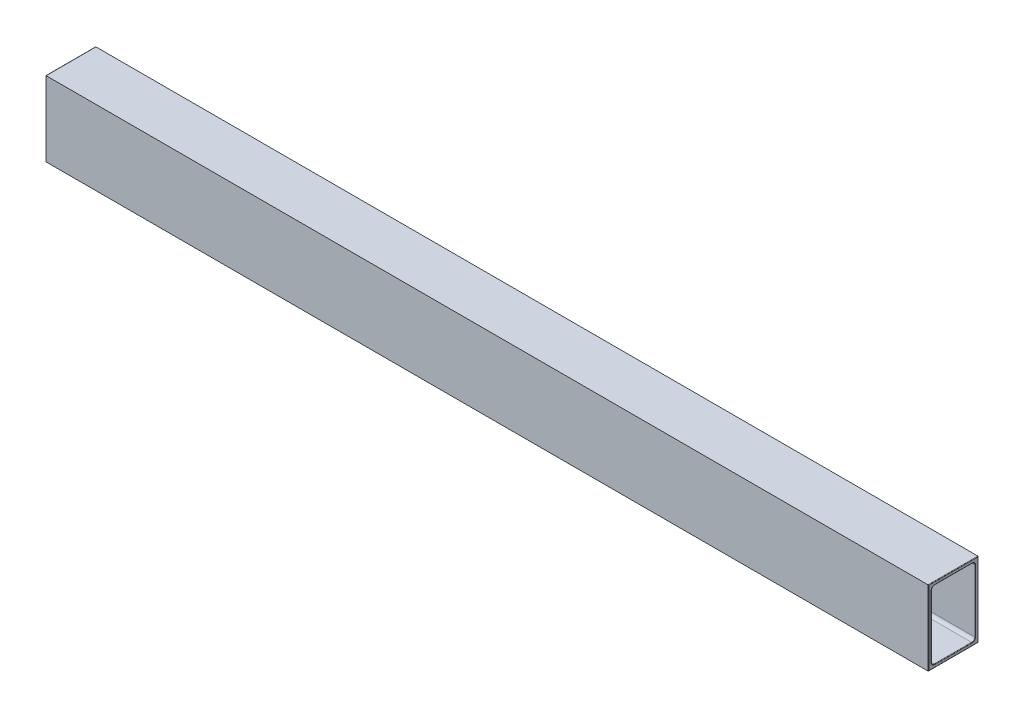
ISO-10303-21;
HEADER;
FILE_DESCRIPTION(('STEP AP214'),'2;1');
FILE_NAME('part.step','',(''),(''),'','','');
FILE_SCHEMA(('AUTOMOTIVE_DESIGN { 1 0 10303 214 1 1 1 1 }'));
ENDSEC;
DATA;
#1=APPLICATION_CONTEXT('core data for automotive mechanical design processes');
#2=APPLICATION_PROTOCOL_DEFINITION('international standard','automotive_design',2000,#1);
#3=PRODUCT_CONTEXT('',#1,'mechanical');
#4=PRODUCT('Part','Part','',(#3));
#5=PRODUCT_RELATED_PRODUCT_CATEGORY('part','',(#4));
#6=PRODUCT_DEFINITION_FORMATION('','',#4);
#7=PRODUCT_DEFINITION_CONTEXT('part definition',#1,'design');
#8=PRODUCT_DEFINITION('design','',#6,#7);
#9=PRODUCT_DEFINITION_SHAPE('','',#8);
#10=(LENGTH_UNIT() NAMED_UNIT(*) SI_UNIT(.MILLI.,.METRE.));
#11=(NAMED_UNIT(*) PLANE_ANGLE_UNIT() SI_UNIT($,.RADIAN.));
#12=(NAMED_UNIT(*) SI_UNIT($,.STERADIAN.) SOLID_ANGLE_UNIT());
#13=UNCERTAINTY_MEASURE_WITH_UNIT(LENGTH_MEASURE(1.E-05),#10,'distance_accuracy_value','');
#14=(GEOMETRIC_REPRESENTATION_CONTEXT(3) GLOBAL_UNCERTAINTY_ASSIGNED_CONTEXT((#13)) GLOBAL_UNIT_ASSIGNED_CONTEXT((#10,
#11,#12)) REPRESENTATION_CONTEXT('',''));
#15=CARTESIAN_POINT('',(0.,0.,0.));
#16=DIRECTION('',(0.,0.,1.));
#17=DIRECTION('',(1.,0.,0.));
#18=AXIS2_PLACEMENT_3D('',#15,#16,#17);
#19=CARTESIAN_POINT('',(1800.,0.,0.));
#20=DIRECTION('',(0.,1.,0.));
#21=DIRECTION('',(0.,0.,1.));
#22=AXIS2_PLACEMENT_3D('',#19,#20,#21);
#23=PLANE('',#22);
#24=DIRECTION('',(0.,0.,-1.));
#25=VECTOR('',#24,1.);
#26=CARTESIAN_POINT('',(747.6,0.,0.));
#27=LINE('',#26,#25);
#28=CARTESIAN_POINT('',(747.6,0.,101.6));
#29=VERTEX_POINT('',#28);
#30=CARTESIAN_POINT('',(747.6,0.,0.));
#31=VERTEX_POINT('',#30);
#32=EDGE_CURVE('E11',#29,#31,#27,.T.);
#33=ORIENTED_EDGE('',*,*,#32,.F.);
#34=DIRECTION('',(-1.,0.,0.));
#35=VECTOR('',#34,1.);
#36=CARTESIAN_POINT('',(1800.,0.,101.6));
#37=LINE('',#36,#35);
#38=CARTESIAN_POINT('',(0.99999999999989,0.,101.6));
#39=VERTEX_POINT('',#38);
#40=EDGE_CURVE('E448',#29,#39,#37,.T.);
#41=ORIENTED_EDGE('',*,*,#40,.T.);
#42=DIRECTION('',(0.,0.,-1.));
#43=VECTOR('',#42,1.);
#44=CARTESIAN_POINT('',(0.99999999999989,0.,0.));
#45=LINE('',#44,#43);
#46=CARTESIAN_POINT('',(0.99999999999989,0.,0.));
#47=VERTEX_POINT('',#46);
#48=EDGE_CURVE('E219',#39,#47,#45,.T.);
#49=ORIENTED_EDGE('',*,*,#48,.T.);
#50=DIRECTION('',(-1.,0.,0.));
#51=VECTOR('',#50,1.);
#52=CARTESIAN_POINT('',(1800.,0.,0.));
#53=LINE('',#52,#51);
#54=EDGE_CURVE('E454',#31,#47,#53,.T.);
#55=ORIENTED_EDGE('',*,*,#54,.F.);
#56=EDGE_LOOP('',(#33,#41,#49,#55));
#57=FACE_BOUND('',#56,.T.);
#58=ADVANCED_FACE('F35',(#57),#23,.F.);
#59=DIRECTION('',(0.,0.,1.));
#60=VECTOR('',#59,1.);
#61=CARTESIAN_POINT('',(1052.4,0.,0.));
#62=LINE('',#61,#60);
#63=CARTESIAN_POINT('',(1052.4,0.,0.));
#64=VERTEX_POINT('',#63);
#65=CARTESIAN_POINT('',(1052.4,0.,101.6));
#66=VERTEX_POINT('',#65);
#67=EDGE_CURVE('E44',#64,#66,#62,.T.);
#68=ORIENTED_EDGE('',*,*,#67,.F.);
#69=CARTESIAN_POINT('',(1799.,0.,0.));
#70=VERTEX_POINT('',#69);
#71=EDGE_CURVE('E450',#70,#64,#53,.T.);
#72=ORIENTED_EDGE('',*,*,#71,.F.);
#73=DIRECTION('',(0.,0.,-1.));
#74=VECTOR('',#73,1.);
#75=CARTESIAN_POINT('',(1799.,0.,101.6));
#76=LINE('',#75,#74);
#77=CARTESIAN_POINT('',(1799.,0.,101.6));
#78=VERTEX_POINT('',#77);
#79=EDGE_CURVE('E303',#70,#78,#76,.F.);
#80=ORIENTED_EDGE('',*,*,#79,.T.);
#81=EDGE_CURVE('E443',#78,#66,#37,.T.);
#82=ORIENTED_EDGE('',*,*,#81,.T.);
#83=EDGE_LOOP('',(#68,#72,#80,#82));
#84=FACE_BOUND('',#83,.T.);
#85=ADVANCED_FACE('F567',(#84),#23,.F.);
#86=CARTESIAN_POINT('',(1800.,0.,0.));
#87=DIRECTION('',(1.,0.,0.));
#88=DIRECTION('',(0.,0.,-1.));
#89=AXIS2_PLACEMENT_3D('',#86,#87,#88);
#90=PLANE('',#89);
#91=DIRECTION('',(0.,1.,0.));
#92=VECTOR('',#91,1.);
#93=CARTESIAN_POINT('',(1800.,0.,5.35));
#94=LINE('',#93,#92);
#95=CARTESIAN_POINT('',(1800.,139.7,5.34999999999999));
#96=VERTEX_POINT('',#95);
#97=CARTESIAN_POINT('',(1800.,12.7,5.35));
#98=VERTEX_POINT('',#97);
#99=EDGE_CURVE('E271',#96,#98,#94,.F.);
#100=ORIENTED_EDGE('',*,*,#99,.T.);
#101=CARTESIAN_POINT('',(1800.,12.7,12.7));
#102=DIRECTION('',(1.,0.,0.));
#103=DIRECTION('',(0.,0.,-1.));
#104=AXIS2_PLACEMENT_3D('',#101,#102,#103);
#105=CIRCLE('',#104,7.35);
#106=CARTESIAN_POINT('',(1800.,5.35,12.7));
#107=VERTEX_POINT('',#106);
#108=EDGE_CURVE('E273',#98,#107,#105,.F.);
#109=ORIENTED_EDGE('',*,*,#108,.T.);
#110=DIRECTION('',(0.,0.,-1.));
#111=VECTOR('',#110,1.);
#112=CARTESIAN_POINT('',(1800.,5.35,0.));
#113=LINE('',#112,#111);
#114=CARTESIAN_POINT('',(1800.,5.34999999999999,88.9));
#115=VERTEX_POINT('',#114);
#116=EDGE_CURVE('E236',#107,#115,#113,.F.);
#117=ORIENTED_EDGE('',*,*,#116,.T.);
#118=CARTESIAN_POINT('',(1800.,12.7,88.9));
#119=DIRECTION('',(1.,0.,0.));
#120=DIRECTION('',(0.,0.,-1.));
#121=AXIS2_PLACEMENT_3D('',#118,#119,#120);
#122=CIRCLE('',#121,7.35);
#123=CARTESIAN_POINT('',(1800.,12.7,96.25));
#124=VERTEX_POINT('',#123);
#125=EDGE_CURVE('E261',#115,#124,#122,.F.);
#126=ORIENTED_EDGE('',*,*,#125,.T.);
#127=DIRECTION('',(0.,-1.,0.));
#128=VECTOR('',#127,1.);
#129=CARTESIAN_POINT('',(1800.,0.,96.25));
#130=LINE('',#129,#128);
#131=CARTESIAN_POINT('',(1800.,139.7,96.25));
#132=VERTEX_POINT('',#131);
#133=EDGE_CURVE('E263',#124,#132,#130,.F.);
#134=ORIENTED_EDGE('',*,*,#133,.T.);
#135=CARTESIAN_POINT('',(1800.,139.7,88.9));
#136=DIRECTION('',(1.,0.,0.));
#137=DIRECTION('',(0.,0.,-1.));
#138=AXIS2_PLACEMENT_3D('',#135,#136,#137);
#139=CIRCLE('',#138,7.34999999999999);
#140=CARTESIAN_POINT('',(1800.,147.05,88.9));
#141=VERTEX_POINT('',#140);
#142=EDGE_CURVE('E265',#132,#141,#139,.F.);
#143=ORIENTED_EDGE('',*,*,#142,.T.);
#144=DIRECTION('',(0.,0.,1.));
#145=VECTOR('',#144,1.);
#146=CARTESIAN_POINT('',(1800.,147.05,1.07124865991555E-13));
#147=LINE('',#146,#145);
#148=CARTESIAN_POINT('',(1800.,147.05,12.7));
#149=VERTEX_POINT('',#148);
#150=EDGE_CURVE('E267',#141,#149,#147,.F.);
#151=ORIENTED_EDGE('',*,*,#150,.T.);
#152=CARTESIAN_POINT('',(1800.,139.7,12.7));
#153=DIRECTION('',(1.,0.,0.));
#154=DIRECTION('',(0.,0.,-1.));
#155=AXIS2_PLACEMENT_3D('',#152,#153,#154);
#156=CIRCLE('',#155,7.35000000000001);
#157=EDGE_CURVE('E269',#149,#96,#156,.F.);
#158=ORIENTED_EDGE('',*,*,#157,.T.);
#159=EDGE_LOOP('',(#100,#109,#117,#126,#134,#143,#151,#158));
#160=FACE_BOUND('',#159,.T.);
#161=DIRECTION('',(0.,-1.,0.));
#162=VECTOR('',#161,1.);
#163=CARTESIAN_POINT('',(1800.,0.,100.6));
#164=LINE('',#163,#162);
#165=CARTESIAN_POINT('',(1800.,151.4,100.6));
#166=VERTEX_POINT('',#165);
#167=CARTESIAN_POINT('',(1800.,0.999999999999982,100.6));
#168=VERTEX_POINT('',#167);
#169=EDGE_CURVE('E255',#166,#168,#164,.T.);
#170=ORIENTED_EDGE('',*,*,#169,.T.);
#171=DIRECTION('',(0.,0.,-1.));
#172=VECTOR('',#171,1.);
#173=CARTESIAN_POINT('',(1800.,1.,0.));
#174=LINE('',#173,#172);
#175=CARTESIAN_POINT('',(1800.,1.,1.));
#176=VERTEX_POINT('',#175);
#177=EDGE_CURVE('E257',#168,#176,#174,.T.);
#178=ORIENTED_EDGE('',*,*,#177,.T.);
#179=DIRECTION('',(0.,1.,0.));
#180=VECTOR('',#179,1.);
#181=CARTESIAN_POINT('',(1800.,152.4,1.));
#182=LINE('',#181,#180);
#183=CARTESIAN_POINT('',(1800.,151.4,1.));
#184=VERTEX_POINT('',#183);
#185=EDGE_CURVE('E246',#176,#184,#182,.T.);
#186=ORIENTED_EDGE('',*,*,#185,.T.);
#187=DIRECTION('',(0.,0.,1.));
#188=VECTOR('',#187,1.);
#189=CARTESIAN_POINT('',(1800.,151.4,101.6));
#190=LINE('',#189,#188);
#191=EDGE_CURVE('E248',#184,#166,#190,.T.);
#192=ORIENTED_EDGE('',*,*,#191,.T.);
#193=EDGE_LOOP('',(#170,#178,#186,#192));
#194=FACE_BOUND('',#193,.T.);
#195=ADVANCED_FACE('F537',(#160,#194),#90,.T.);
#196=CARTESIAN_POINT('',(0.,0.,0.));
#197=DIRECTION('',(1.,0.,0.));
#198=DIRECTION('',(0.,0.,-1.));
#199=AXIS2_PLACEMENT_3D('',#196,#197,#198);
#200=PLANE('',#199);
#201=CARTESIAN_POINT('',(0.,139.7,88.9));
#202=DIRECTION('',(1.,0.,0.));
#203=DIRECTION('',(0.,0.,-1.));
#204=AXIS2_PLACEMENT_3D('',#201,#202,#203);
#205=CIRCLE('',#204,7.34999999999999);
#206=CARTESIAN_POINT('',(0.,147.05,88.9));
#207=VERTEX_POINT('',#206);
#208=CARTESIAN_POINT('',(0.,139.7,96.25));
#209=VERTEX_POINT('',#208);
#210=EDGE_CURVE('E341',#207,#209,#205,.T.);
#211=ORIENTED_EDGE('',*,*,#210,.T.);
#212=DIRECTION('',(0.,-1.,0.));
#213=VECTOR('',#212,1.);
#214=CARTESIAN_POINT('',(0.,12.7,96.25));
#215=LINE('',#214,#213);
#216=CARTESIAN_POINT('',(0.,12.7,96.25));
#217=VERTEX_POINT('',#216);
#218=EDGE_CURVE('E343',#209,#217,#215,.T.);
#219=ORIENTED_EDGE('',*,*,#218,.T.);
#220=CARTESIAN_POINT('',(0.,12.7,88.9));
#221=DIRECTION('',(1.,0.,0.));
#222=DIRECTION('',(0.,0.,-1.));
#223=AXIS2_PLACEMENT_3D('',#220,#221,#222);
#224=CIRCLE('',#223,7.35);
#225=CARTESIAN_POINT('',(0.,5.34999999999999,88.9));
#226=VERTEX_POINT('',#225);
#227=EDGE_CURVE('E329',#217,#226,#224,.T.);
#228=ORIENTED_EDGE('',*,*,#227,.T.);
#229=DIRECTION('',(0.,0.,-1.));
#230=VECTOR('',#229,1.);
#231=CARTESIAN_POINT('',(0.,5.35,12.7));
#232=LINE('',#231,#230);
#233=CARTESIAN_POINT('',(0.,5.35,12.7));
#234=VERTEX_POINT('',#233);
#235=EDGE_CURVE('E331',#226,#234,#232,.T.);
#236=ORIENTED_EDGE('',*,*,#235,.T.);
#237=CARTESIAN_POINT('',(0.,12.7,12.7));
#238=DIRECTION('',(1.,0.,0.));
#239=DIRECTION('',(0.,0.,-1.));
#240=AXIS2_PLACEMENT_3D('',#237,#238,#239);
#241=CIRCLE('',#240,7.35);
#242=CARTESIAN_POINT('',(0.,12.7,5.35));
#243=VERTEX_POINT('',#242);
#244=EDGE_CURVE('E333',#234,#243,#241,.T.);
#245=ORIENTED_EDGE('',*,*,#244,.T.);
#246=DIRECTION('',(0.,1.,0.));
#247=VECTOR('',#246,1.);
#248=CARTESIAN_POINT('',(0.,139.7,5.35));
#249=LINE('',#248,#247);
#250=CARTESIAN_POINT('',(0.,139.7,5.35));
#251=VERTEX_POINT('',#250);
#252=EDGE_CURVE('E335',#243,#251,#249,.T.);
#253=ORIENTED_EDGE('',*,*,#252,.T.);
#254=CARTESIAN_POINT('',(0.,139.7,12.7));
#255=DIRECTION('',(1.,0.,0.));
#256=DIRECTION('',(0.,0.,-1.));
#257=AXIS2_PLACEMENT_3D('',#254,#255,#256);
#258=CIRCLE('',#257,7.35000000000001);
#259=CARTESIAN_POINT('',(0.,147.05,12.7));
#260=VERTEX_POINT('',#259);
#261=EDGE_CURVE('E337',#251,#260,#258,.T.);
#262=ORIENTED_EDGE('',*,*,#261,.T.);
#263=DIRECTION('',(0.,0.,1.));
#264=VECTOR('',#263,1.);
#265=CARTESIAN_POINT('',(0.,147.05,88.9));
#266=LINE('',#265,#264);
#267=EDGE_CURVE('E339',#260,#207,#266,.T.);
#268=ORIENTED_EDGE('',*,*,#267,.T.);
#269=EDGE_LOOP('',(#211,#219,#228,#236,#245,#253,#262,#268));
#270=FACE_BOUND('',#269,.T.);
#271=DIRECTION('',(0.,-1.,0.));
#272=VECTOR('',#271,1.);
#273=CARTESIAN_POINT('',(0.,0.,100.6));
#274=LINE('',#273,#272);
#275=CARTESIAN_POINT('',(0.,0.999999999999982,100.6));
#276=VERTEX_POINT('',#275);
#277=CARTESIAN_POINT('',(0.,151.4,100.6));
#278=VERTEX_POINT('',#277);
#279=EDGE_CURVE('E324',#276,#278,#274,.F.);
#280=ORIENTED_EDGE('',*,*,#279,.T.);
#281=DIRECTION('',(0.,0.,1.));
#282=VECTOR('',#281,1.);
#283=CARTESIAN_POINT('',(0.,151.4,0.));
#284=LINE('',#283,#282);
#285=CARTESIAN_POINT('',(0.,151.4,1.));
#286=VERTEX_POINT('',#285);
#287=EDGE_CURVE('E326',#278,#286,#284,.F.);
#288=ORIENTED_EDGE('',*,*,#287,.T.);
#289=DIRECTION('',(0.,1.,0.));
#290=VECTOR('',#289,1.);
#291=CARTESIAN_POINT('',(0.,0.,1.));
#292=LINE('',#291,#290);
#293=CARTESIAN_POINT('',(0.,1.,1.));
#294=VERTEX_POINT('',#293);
#295=EDGE_CURVE('E320',#286,#294,#292,.F.);
#296=ORIENTED_EDGE('',*,*,#295,.T.);
#297=DIRECTION('',(0.,0.,-1.));
#298=VECTOR('',#297,1.);
#299=CARTESIAN_POINT('',(0.,1.,0.));
#300=LINE('',#299,#298);
#301=EDGE_CURVE('E322',#294,#276,#300,.F.);
#302=ORIENTED_EDGE('',*,*,#301,.T.);
#303=EDGE_LOOP('',(#280,#288,#296,#302));
#304=FACE_BOUND('',#303,.T.);
#305=ADVANCED_FACE('F422',(#270,#304),#200,.F.);
#306=CARTESIAN_POINT('',(1800.,0.,0.));
#307=DIRECTION('',(0.,0.,1.));
#308=DIRECTION('',(1.,0.,0.));
#309=AXIS2_PLACEMENT_3D('',#306,#307,#308);
#310=PLANE('',#309);
#311=DIRECTION('',(-1.,0.,0.));
#312=VECTOR('',#311,1.);
#313=CARTESIAN_POINT('',(1800.,152.4,0.));
#314=LINE('',#313,#312);
#315=CARTESIAN_POINT('',(1799.,152.4,0.));
#316=VERTEX_POINT('',#315);
#317=CARTESIAN_POINT('',(0.99999999999989,152.4,0.));
#318=VERTEX_POINT('',#317);
#319=EDGE_CURVE('E250',#316,#318,#314,.T.);
#320=ORIENTED_EDGE('',*,*,#319,.F.);
#321=DIRECTION('',(0.,1.,0.));
#322=VECTOR('',#321,1.);
#323=CARTESIAN_POINT('',(1799.,0.,0.));
#324=LINE('',#323,#322);
#325=EDGE_CURVE('E318',#316,#70,#324,.F.);
#326=ORIENTED_EDGE('',*,*,#325,.T.);
#327=ORIENTED_EDGE('',*,*,#71,.T.);
#328=EDGE_CURVE('E453',#64,#31,#53,.T.);
#329=ORIENTED_EDGE('',*,*,#328,.T.);
#330=ORIENTED_EDGE('',*,*,#54,.T.);
#331=DIRECTION('',(0.,1.,0.));
#332=VECTOR('',#331,1.);
#333=CARTESIAN_POINT('',(0.99999999999989,0.,0.));
#334=LINE('',#333,#332);
#335=EDGE_CURVE('E316',#47,#318,#334,.T.);
#336=ORIENTED_EDGE('',*,*,#335,.T.);
#337=EDGE_LOOP('',(#320,#326,#327,#329,#330,#336));
#338=FACE_BOUND('',#337,.T.);
#339=ADVANCED_FACE('F584',(#338),#310,.F.);
#340=CARTESIAN_POINT('',(1800.,152.4,0.));
#341=DIRECTION('',(0.,-1.,0.));
#342=DIRECTION('',(0.,0.,-1.));
#343=AXIS2_PLACEMENT_3D('',#340,#341,#342);
#344=PLANE('',#343);
#345=DIRECTION('',(-1.,0.,0.));
#346=VECTOR('',#345,1.);
#347=CARTESIAN_POINT('',(1800.,152.4,101.6));
#348=LINE('',#347,#346);
#349=CARTESIAN_POINT('',(1799.,152.4,101.6));
#350=VERTEX_POINT('',#349);
#351=CARTESIAN_POINT('',(0.99999999999989,152.4,101.6));
#352=VERTEX_POINT('',#351);
#353=EDGE_CURVE('E437',#350,#352,#348,.T.);
#354=ORIENTED_EDGE('',*,*,#353,.F.);
#355=DIRECTION('',(0.,0.,1.));
#356=VECTOR('',#355,1.);
#357=CARTESIAN_POINT('',(1799.,152.4,0.));
#358=LINE('',#357,#356);
#359=EDGE_CURVE('E314',#350,#316,#358,.F.);
#360=ORIENTED_EDGE('',*,*,#359,.T.);
#361=ORIENTED_EDGE('',*,*,#319,.T.);
#362=DIRECTION('',(0.,0.,1.));
#363=VECTOR('',#362,1.);
#364=CARTESIAN_POINT('',(0.99999999999989,152.4,0.));
#365=LINE('',#364,#363);
#366=EDGE_CURVE('E311',#318,#352,#365,.T.);
#367=ORIENTED_EDGE('',*,*,#366,.T.);
#368=EDGE_LOOP('',(#354,#360,#361,#367));
#369=FACE_BOUND('',#368,.T.);
#370=ADVANCED_FACE('F436',(#369),#344,.F.);
#371=CARTESIAN_POINT('',(1800.,0.,101.6));
#372=DIRECTION('',(0.,0.,-1.));
#373=DIRECTION('',(-1.,0.,0.));
#374=AXIS2_PLACEMENT_3D('',#371,#372,#373);
#375=PLANE('',#374);
#376=ORIENTED_EDGE('',*,*,#81,.F.);
#377=DIRECTION('',(0.,-1.,0.));
#378=VECTOR('',#377,1.);
#379=CARTESIAN_POINT('',(1799.,152.4,101.6));
#380=LINE('',#379,#378);
#381=EDGE_CURVE('E309',#78,#350,#380,.F.);
#382=ORIENTED_EDGE('',*,*,#381,.T.);
#383=ORIENTED_EDGE('',*,*,#353,.T.);
#384=DIRECTION('',(0.,-1.,0.));
#385=VECTOR('',#384,1.);
#386=CARTESIAN_POINT('',(0.99999999999989,0.,101.6));
#387=LINE('',#386,#385);
#388=EDGE_CURVE('E306',#352,#39,#387,.T.);
#389=ORIENTED_EDGE('',*,*,#388,.T.);
#390=ORIENTED_EDGE('',*,*,#40,.F.);
#391=EDGE_CURVE('E446',#66,#29,#37,.T.);
#392=ORIENTED_EDGE('',*,*,#391,.F.);
#393=EDGE_LOOP('',(#376,#382,#383,#389,#390,#392));
#394=FACE_BOUND('',#393,.T.);
#395=ADVANCED_FACE('F441',(#394),#375,.F.);
#396=ORIENTED_EDGE('',*,*,#391,.T.);
#397=ORIENTED_EDGE('',*,*,#32,.T.);
#398=ORIENTED_EDGE('',*,*,#328,.F.);
#399=ORIENTED_EDGE('',*,*,#67,.T.);
#400=EDGE_LOOP('',(#396,#397,#398,#399));
#401=FACE_BOUND('',#400,.T.);
#402=ADVANCED_FACE('F569',(#401),#23,.F.);
#403=CARTESIAN_POINT('',(1800.,12.7,88.9));
#404=DIRECTION('',(-1.,0.,0.));
#405=DIRECTION('',(0.,0.,1.));
#406=AXIS2_PLACEMENT_3D('',#403,#404,#405);
#407=CYLINDRICAL_SURFACE('',#406,6.35);
#408=DIRECTION('',(-1.,0.,0.));
#409=VECTOR('',#408,1.);
#410=CARTESIAN_POINT('',(1800.,12.7,95.25));
#411=LINE('',#410,#409);
#412=CARTESIAN_POINT('',(1799.,12.7,95.25));
#413=VERTEX_POINT('',#412);
#414=CARTESIAN_POINT('',(0.99999999999989,12.7,95.25));
#415=VERTEX_POINT('',#414);
#416=EDGE_CURVE('E364',#413,#415,#411,.T.);
#417=ORIENTED_EDGE('',*,*,#416,.F.);
#418=CARTESIAN_POINT('',(1799.,12.7,88.9));
#419=DIRECTION('',(1.,0.,0.));
#420=DIRECTION('',(0.,0.,-1.));
#421=AXIS2_PLACEMENT_3D('',#418,#419,#420);
#422=CIRCLE('',#421,6.35);
#423=CARTESIAN_POINT('',(1799.,6.34999999999999,88.9));
#424=VERTEX_POINT('',#423);
#425=EDGE_CURVE('E298',#413,#424,#422,.T.);
#426=ORIENTED_EDGE('',*,*,#425,.T.);
#427=DIRECTION('',(-1.,0.,0.));
#428=VECTOR('',#427,1.);
#429=CARTESIAN_POINT('',(1800.,6.34999999999999,88.9));
#430=LINE('',#429,#428);
#431=CARTESIAN_POINT('',(0.99999999999989,6.34999999999999,88.9));
#432=VERTEX_POINT('',#431);
#433=EDGE_CURVE('E214',#424,#432,#430,.T.);
#434=ORIENTED_EDGE('',*,*,#433,.T.);
#435=CARTESIAN_POINT('',(0.99999999999989,12.7,88.9));
#436=DIRECTION('',(1.,0.,0.));
#437=DIRECTION('',(0.,0.,-1.));
#438=AXIS2_PLACEMENT_3D('',#435,#436,#437);
#439=CIRCLE('',#438,6.35);
#440=EDGE_CURVE('E296',#432,#415,#439,.F.);
#441=ORIENTED_EDGE('',*,*,#440,.T.);
#442=EDGE_LOOP('',(#417,#426,#434,#441));
#443=FACE_BOUND('',#442,.T.);
#444=ADVANCED_FACE('F530',(#443),#407,.F.);
#445=CARTESIAN_POINT('',(1800.,6.35,12.7));
#446=DIRECTION('',(0.,1.,0.));
#447=DIRECTION('',(0.,0.,1.));
#448=AXIS2_PLACEMENT_3D('',#445,#446,#447);
#449=PLANE('',#448);
#450=ORIENTED_EDGE('',*,*,#433,.F.);
#451=DIRECTION('',(0.,0.,-1.));
#452=VECTOR('',#451,1.);
#453=CARTESIAN_POINT('',(1799.,6.35,12.7));
#454=LINE('',#453,#452);
#455=CARTESIAN_POINT('',(1799.,6.35,12.7));
#456=VERTEX_POINT('',#455);
#457=EDGE_CURVE('E208',#424,#456,#454,.T.);
#458=ORIENTED_EDGE('',*,*,#457,.T.);
#459=DIRECTION('',(-1.,0.,0.));
#460=VECTOR('',#459,1.);
#461=CARTESIAN_POINT('',(1800.,6.35,12.7));
#462=LINE('',#461,#460);
#463=CARTESIAN_POINT('',(0.99999999999989,6.35,12.7));
#464=VERTEX_POINT('',#463);
#465=EDGE_CURVE('E211',#456,#464,#462,.T.);
#466=ORIENTED_EDGE('',*,*,#465,.T.);
#467=DIRECTION('',(0.,0.,-1.));
#468=VECTOR('',#467,1.);
#469=CARTESIAN_POINT('',(1.,6.34999999999999,88.9));
#470=LINE('',#469,#468);
#471=EDGE_CURVE('E220',#464,#432,#470,.F.);
#472=ORIENTED_EDGE('',*,*,#471,.T.);
#473=EDGE_LOOP('',(#450,#458,#466,#472));
#474=FACE_BOUND('',#473,.T.);
#475=ADVANCED_FACE('F210',(#474),#449,.T.);
#476=CARTESIAN_POINT('',(1800.,12.7,12.7));
#477=DIRECTION('',(-1.,0.,0.));
#478=DIRECTION('',(0.,0.,1.));
#479=AXIS2_PLACEMENT_3D('',#476,#477,#478);
#480=CYLINDRICAL_SURFACE('',#479,6.35);
#481=ORIENTED_EDGE('',*,*,#465,.F.);
#482=CARTESIAN_POINT('',(1799.,12.7,12.7));
#483=DIRECTION('',(1.,0.,0.));
#484=DIRECTION('',(0.,0.,-1.));
#485=AXIS2_PLACEMENT_3D('',#482,#483,#484);
#486=CIRCLE('',#485,6.35);
#487=CARTESIAN_POINT('',(1799.,12.7,6.35));
#488=VERTEX_POINT('',#487);
#489=EDGE_CURVE('E227',#456,#488,#486,.T.);
#490=ORIENTED_EDGE('',*,*,#489,.T.);
#491=DIRECTION('',(-1.,0.,0.));
#492=VECTOR('',#491,1.);
#493=CARTESIAN_POINT('',(1800.,12.7,6.35));
#494=LINE('',#493,#492);
#495=CARTESIAN_POINT('',(0.99999999999989,12.7,6.35));
#496=VERTEX_POINT('',#495);
#497=EDGE_CURVE('E231',#488,#496,#494,.T.);
#498=ORIENTED_EDGE('',*,*,#497,.T.);
#499=CARTESIAN_POINT('',(0.99999999999989,12.7,12.7));
#500=DIRECTION('',(1.,0.,0.));
#501=DIRECTION('',(0.,0.,-1.));
#502=AXIS2_PLACEMENT_3D('',#499,#500,#501);
#503=CIRCLE('',#502,6.35);
#504=EDGE_CURVE('E230',#496,#464,#503,.F.);
#505=ORIENTED_EDGE('',*,*,#504,.T.);
#506=EDGE_LOOP('',(#481,#490,#498,#505));
#507=FACE_BOUND('',#506,.T.);
#508=ADVANCED_FACE('F224',(#507),#480,.F.);
#509=CARTESIAN_POINT('',(1800.,12.7,6.35));
#510=DIRECTION('',(0.,0.,1.));
#511=DIRECTION('',(0.,-1.,0.));
#512=AXIS2_PLACEMENT_3D('',#509,#510,#511);
#513=PLANE('',#512);
#514=ORIENTED_EDGE('',*,*,#497,.F.);
#515=DIRECTION('',(0.,1.,0.));
#516=VECTOR('',#515,1.);
#517=CARTESIAN_POINT('',(1799.,12.7,6.35));
#518=LINE('',#517,#516);
#519=CARTESIAN_POINT('',(1799.,139.7,6.34999999999999));
#520=VERTEX_POINT('',#519);
#521=EDGE_CURVE('E277',#488,#520,#518,.T.);
#522=ORIENTED_EDGE('',*,*,#521,.T.);
#523=DIRECTION('',(-1.,0.,0.));
#524=VECTOR('',#523,1.);
#525=CARTESIAN_POINT('',(1800.,139.7,6.34999999999999));
#526=LINE('',#525,#524);
#527=CARTESIAN_POINT('',(0.99999999999989,139.7,6.34999999999999));
#528=VERTEX_POINT('',#527);
#529=EDGE_CURVE('E457',#520,#528,#526,.T.);
#530=ORIENTED_EDGE('',*,*,#529,.T.);
#531=DIRECTION('',(0.,1.,0.));
#532=VECTOR('',#531,1.);
#533=CARTESIAN_POINT('',(1.,12.7,6.35));
#534=LINE('',#533,#532);
#535=EDGE_CURVE('E275',#528,#496,#534,.F.);
#536=ORIENTED_EDGE('',*,*,#535,.T.);
#537=EDGE_LOOP('',(#514,#522,#530,#536));
#538=FACE_BOUND('',#537,.T.);
#539=ADVANCED_FACE('F519',(#538),#513,.T.);
#540=CARTESIAN_POINT('',(1800.,139.7,12.7));
#541=DIRECTION('',(-1.,0.,0.));
#542=DIRECTION('',(0.,0.,1.));
#543=AXIS2_PLACEMENT_3D('',#540,#541,#542);
#544=CYLINDRICAL_SURFACE('',#543,6.35000000000001);
#545=ORIENTED_EDGE('',*,*,#529,.F.);
#546=CARTESIAN_POINT('',(1799.,139.7,12.7));
#547=DIRECTION('',(1.,0.,0.));
#548=DIRECTION('',(0.,0.,-1.));
#549=AXIS2_PLACEMENT_3D('',#546,#547,#548);
#550=CIRCLE('',#549,6.35000000000001);
#551=CARTESIAN_POINT('',(1799.,146.05,12.7));
#552=VERTEX_POINT('',#551);
#553=EDGE_CURVE('E281',#520,#552,#550,.T.);
#554=ORIENTED_EDGE('',*,*,#553,.T.);
#555=DIRECTION('',(-1.,0.,0.));
#556=VECTOR('',#555,1.);
#557=CARTESIAN_POINT('',(1800.,146.05,12.7));
#558=LINE('',#557,#556);
#559=CARTESIAN_POINT('',(0.99999999999989,146.05,12.7));
#560=VERTEX_POINT('',#559);
#561=EDGE_CURVE('E460',#552,#560,#558,.T.);
#562=ORIENTED_EDGE('',*,*,#561,.T.);
#563=CARTESIAN_POINT('',(0.99999999999989,139.7,12.7));
#564=DIRECTION('',(1.,0.,0.));
#565=DIRECTION('',(0.,0.,-1.));
#566=AXIS2_PLACEMENT_3D('',#563,#564,#565);
#567=CIRCLE('',#566,6.35000000000001);
#568=EDGE_CURVE('E279',#560,#528,#567,.F.);
#569=ORIENTED_EDGE('',*,*,#568,.T.);
#570=EDGE_LOOP('',(#545,#554,#562,#569));
#571=FACE_BOUND('',#570,.T.);
#572=ADVANCED_FACE('F515',(#571),#544,.F.);
#573=CARTESIAN_POINT('',(1800.,146.05,12.7));
#574=DIRECTION('',(0.,-1.,0.));
#575=DIRECTION('',(0.,0.,-1.));
#576=AXIS2_PLACEMENT_3D('',#573,#574,#575);
#577=PLANE('',#576);
#578=ORIENTED_EDGE('',*,*,#561,.F.);
#579=DIRECTION('',(0.,0.,1.));
#580=VECTOR('',#579,1.);
#581=CARTESIAN_POINT('',(1799.,146.05,12.7));
#582=LINE('',#581,#580);
#583=CARTESIAN_POINT('',(1799.,146.05,88.9));
#584=VERTEX_POINT('',#583);
#585=EDGE_CURVE('E285',#552,#584,#582,.T.);
#586=ORIENTED_EDGE('',*,*,#585,.T.);
#587=DIRECTION('',(-1.,0.,0.));
#588=VECTOR('',#587,1.);
#589=CARTESIAN_POINT('',(1800.,146.05,88.9));
#590=LINE('',#589,#588);
#591=CARTESIAN_POINT('',(0.99999999999989,146.05,88.9));
#592=VERTEX_POINT('',#591);
#593=EDGE_CURVE('E463',#584,#592,#590,.T.);
#594=ORIENTED_EDGE('',*,*,#593,.T.);
#595=DIRECTION('',(0.,0.,1.));
#596=VECTOR('',#595,1.);
#597=CARTESIAN_POINT('',(1.,146.05,12.7));
#598=LINE('',#597,#596);
#599=EDGE_CURVE('E283',#592,#560,#598,.F.);
#600=ORIENTED_EDGE('',*,*,#599,.T.);
#601=EDGE_LOOP('',(#578,#586,#594,#600));
#602=FACE_BOUND('',#601,.T.);
#603=ADVANCED_FACE('F503',(#602),#577,.T.);
#604=CARTESIAN_POINT('',(1800.,139.7,88.9));
#605=DIRECTION('',(-1.,0.,0.));
#606=DIRECTION('',(0.,0.,1.));
#607=AXIS2_PLACEMENT_3D('',#604,#605,#606);
#608=CYLINDRICAL_SURFACE('',#607,6.34999999999999);
#609=ORIENTED_EDGE('',*,*,#593,.F.);
#610=CARTESIAN_POINT('',(1799.,139.7,88.9));
#611=DIRECTION('',(1.,0.,0.));
#612=DIRECTION('',(0.,0.,-1.));
#613=AXIS2_PLACEMENT_3D('',#610,#611,#612);
#614=CIRCLE('',#613,6.34999999999999);
#615=CARTESIAN_POINT('',(1799.,139.7,95.25));
#616=VERTEX_POINT('',#615);
#617=EDGE_CURVE('E289',#584,#616,#614,.T.);
#618=ORIENTED_EDGE('',*,*,#617,.T.);
#619=DIRECTION('',(-1.,0.,0.));
#620=VECTOR('',#619,1.);
#621=CARTESIAN_POINT('',(1800.,139.7,95.25));
#622=LINE('',#621,#620);
#623=CARTESIAN_POINT('',(0.99999999999989,139.7,95.25));
#624=VERTEX_POINT('',#623);
#625=EDGE_CURVE('E466',#616,#624,#622,.T.);
#626=ORIENTED_EDGE('',*,*,#625,.T.);
#627=CARTESIAN_POINT('',(0.99999999999989,139.7,88.9));
#628=DIRECTION('',(1.,0.,0.));
#629=DIRECTION('',(0.,0.,-1.));
#630=AXIS2_PLACEMENT_3D('',#627,#628,#629);
#631=CIRCLE('',#630,6.34999999999999);
#632=EDGE_CURVE('E287',#624,#592,#631,.F.);
#633=ORIENTED_EDGE('',*,*,#632,.T.);
#634=EDGE_LOOP('',(#609,#618,#626,#633));
#635=FACE_BOUND('',#634,.T.);
#636=ADVANCED_FACE('F498',(#635),#608,.F.);
#637=CARTESIAN_POINT('',(1800.,12.7,95.25));
#638=DIRECTION('',(0.,0.,-1.));
#639=DIRECTION('',(-1.,0.,0.));
#640=AXIS2_PLACEMENT_3D('',#637,#638,#639);
#641=PLANE('',#640);
#642=ORIENTED_EDGE('',*,*,#625,.F.);
#643=DIRECTION('',(0.,-1.,0.));
#644=VECTOR('',#643,1.);
#645=CARTESIAN_POINT('',(1799.,12.7,95.25));
#646=LINE('',#645,#644);
#647=EDGE_CURVE('E294',#616,#413,#646,.T.);
#648=ORIENTED_EDGE('',*,*,#647,.T.);
#649=ORIENTED_EDGE('',*,*,#416,.T.);
#650=DIRECTION('',(0.,-1.,0.));
#651=VECTOR('',#650,1.);
#652=CARTESIAN_POINT('',(1.,139.7,95.25));
#653=LINE('',#652,#651);
#654=EDGE_CURVE('E291',#415,#624,#653,.F.);
#655=ORIENTED_EDGE('',*,*,#654,.T.);
#656=EDGE_LOOP('',(#642,#648,#649,#655));
#657=FACE_BOUND('',#656,.T.);
#658=ADVANCED_FACE('F474',(#657),#641,.T.);
#659=CARTESIAN_POINT('',(1799.,139.7,88.9));
#660=DIRECTION('',(1.,0.,0.));
#661=DIRECTION('',(0.,0.,-1.));
#662=AXIS2_PLACEMENT_3D('',#659,#660,#661);
#663=TOROIDAL_SURFACE('',#662,7.34999999999999,1.);
#664=CARTESIAN_POINT('',(1799.,147.05,88.9));
#665=DIRECTION('',(0.,0.,-1.));
#666=DIRECTION('',(-1.,0.,0.));
#667=AXIS2_PLACEMENT_3D('',#664,#665,#666);
#668=CIRCLE('',#667,1.);
#669=EDGE_CURVE('E358',#141,#584,#668,.T.);
#670=ORIENTED_EDGE('',*,*,#669,.F.);
#671=ORIENTED_EDGE('',*,*,#142,.F.);
#672=CARTESIAN_POINT('',(1799.,139.7,96.25));
#673=DIRECTION('',(0.,-1.,0.));
#674=DIRECTION('',(0.,0.,-1.));
#675=AXIS2_PLACEMENT_3D('',#672,#673,#674);
#676=CIRCLE('',#675,1.);
#677=EDGE_CURVE('E361',#616,#132,#676,.T.);
#678=ORIENTED_EDGE('',*,*,#677,.F.);
#679=ORIENTED_EDGE('',*,*,#617,.F.);
#680=EDGE_LOOP('',(#670,#671,#678,#679));
#681=FACE_BOUND('',#680,.T.);
#682=ADVANCED_FACE('F545',(#681),#663,.T.);
#683=CARTESIAN_POINT('',(1799.,12.7,96.25));
#684=DIRECTION('',(0.,-1.,0.));
#685=DIRECTION('',(0.,0.,-1.));
#686=AXIS2_PLACEMENT_3D('',#683,#684,#685);
#687=CYLINDRICAL_SURFACE('',#686,1.);
#688=ORIENTED_EDGE('',*,*,#677,.T.);
#689=ORIENTED_EDGE('',*,*,#133,.F.);
#690=CARTESIAN_POINT('',(1799.,12.7,96.25));
#691=DIRECTION('',(0.,-1.,0.));
#692=DIRECTION('',(0.,0.,-1.));
#693=AXIS2_PLACEMENT_3D('',#690,#691,#692);
#694=CIRCLE('',#693,1.);
#695=EDGE_CURVE('E355',#413,#124,#694,.T.);
#696=ORIENTED_EDGE('',*,*,#695,.F.);
#697=ORIENTED_EDGE('',*,*,#647,.F.);
#698=EDGE_LOOP('',(#688,#689,#696,#697));
#699=FACE_BOUND('',#698,.T.);
#700=ADVANCED_FACE('F541',(#699),#687,.T.);
#701=CARTESIAN_POINT('',(1799.,147.05,12.7));
#702=DIRECTION('',(0.,0.,1.));
#703=DIRECTION('',(0.,-1.,0.));
#704=AXIS2_PLACEMENT_3D('',#701,#702,#703);
#705=CYLINDRICAL_SURFACE('',#704,1.);
#706=ORIENTED_EDGE('',*,*,#669,.T.);
#707=ORIENTED_EDGE('',*,*,#585,.F.);
#708=CARTESIAN_POINT('',(1799.,147.05,12.7));
#709=DIRECTION('',(0.,0.,-1.));
#710=DIRECTION('',(-1.,0.,0.));
#711=AXIS2_PLACEMENT_3D('',#708,#709,#710);
#712=CIRCLE('',#711,1.);
#713=EDGE_CURVE('E352',#149,#552,#712,.T.);
#714=ORIENTED_EDGE('',*,*,#713,.F.);
#715=ORIENTED_EDGE('',*,*,#150,.F.);
#716=EDGE_LOOP('',(#706,#707,#714,#715));
#717=FACE_BOUND('',#716,.T.);
#718=ADVANCED_FACE('F551',(#717),#705,.T.);
#719=CARTESIAN_POINT('',(1799.,12.7,88.9));
#720=DIRECTION('',(1.,0.,0.));
#721=DIRECTION('',(0.,0.,-1.));
#722=AXIS2_PLACEMENT_3D('',#719,#720,#721);
#723=TOROIDAL_SURFACE('',#722,7.35,1.);
#724=ORIENTED_EDGE('',*,*,#695,.T.);
#725=ORIENTED_EDGE('',*,*,#125,.F.);
#726=CARTESIAN_POINT('',(1799.,5.34999999999999,88.9));
#727=DIRECTION('',(0.,0.,-1.));
#728=DIRECTION('',(-1.,0.,0.));
#729=AXIS2_PLACEMENT_3D('',#726,#727,#728);
#730=CIRCLE('',#729,1.);
#731=EDGE_CURVE('E350',#424,#115,#730,.T.);
#732=ORIENTED_EDGE('',*,*,#731,.F.);
#733=ORIENTED_EDGE('',*,*,#425,.F.);
#734=EDGE_LOOP('',(#724,#725,#732,#733));
#735=FACE_BOUND('',#734,.T.);
#736=ADVANCED_FACE('F533',(#735),#723,.T.);
#737=CARTESIAN_POINT('',(1799.,139.7,12.7));
#738=DIRECTION('',(1.,0.,0.));
#739=DIRECTION('',(0.,0.,-1.));
#740=AXIS2_PLACEMENT_3D('',#737,#738,#739);
#741=TOROIDAL_SURFACE('',#740,7.35000000000001,1.);
#742=ORIENTED_EDGE('',*,*,#713,.T.);
#743=ORIENTED_EDGE('',*,*,#553,.F.);
#744=CARTESIAN_POINT('',(1799.,139.7,5.34999999999999));
#745=DIRECTION('',(0.,-1.,0.));
#746=DIRECTION('',(0.,0.,-1.));
#747=AXIS2_PLACEMENT_3D('',#744,#745,#746);
#748=CIRCLE('',#747,1.);
#749=EDGE_CURVE('E240',#96,#520,#748,.T.);
#750=ORIENTED_EDGE('',*,*,#749,.F.);
#751=ORIENTED_EDGE('',*,*,#157,.F.);
#752=EDGE_LOOP('',(#742,#743,#750,#751));
#753=FACE_BOUND('',#752,.T.);
#754=ADVANCED_FACE('F553',(#753),#741,.T.);
#755=CARTESIAN_POINT('',(1799.,5.35,12.7));
#756=DIRECTION('',(0.,0.,-1.));
#757=DIRECTION('',(0.,1.,0.));
#758=AXIS2_PLACEMENT_3D('',#755,#756,#757);
#759=CYLINDRICAL_SURFACE('',#758,1.);
#760=ORIENTED_EDGE('',*,*,#731,.T.);
#761=ORIENTED_EDGE('',*,*,#116,.F.);
#762=CARTESIAN_POINT('',(1799.,5.35,12.7));
#763=DIRECTION('',(0.,0.,-1.));
#764=DIRECTION('',(-1.,0.,0.));
#765=AXIS2_PLACEMENT_3D('',#762,#763,#764);
#766=CIRCLE('',#765,1.);
#767=EDGE_CURVE('E234',#456,#107,#766,.T.);
#768=ORIENTED_EDGE('',*,*,#767,.F.);
#769=ORIENTED_EDGE('',*,*,#457,.F.);
#770=EDGE_LOOP('',(#760,#761,#768,#769));
#771=FACE_BOUND('',#770,.T.);
#772=ADVANCED_FACE('F235',(#771),#759,.T.);
#773=CARTESIAN_POINT('',(1799.,12.7,5.35));
#774=DIRECTION('',(0.,1.,0.));
#775=DIRECTION('',(0.,0.,1.));
#776=AXIS2_PLACEMENT_3D('',#773,#774,#775);
#777=CYLINDRICAL_SURFACE('',#776,1.);
#778=ORIENTED_EDGE('',*,*,#749,.T.);
#779=ORIENTED_EDGE('',*,*,#521,.F.);
#780=CARTESIAN_POINT('',(1799.,12.7,5.35));
#781=DIRECTION('',(0.,-1.,0.));
#782=DIRECTION('',(0.,0.,-1.));
#783=AXIS2_PLACEMENT_3D('',#780,#781,#782);
#784=CIRCLE('',#783,1.);
#785=EDGE_CURVE('E241',#98,#488,#784,.T.);
#786=ORIENTED_EDGE('',*,*,#785,.F.);
#787=ORIENTED_EDGE('',*,*,#99,.F.);
#788=EDGE_LOOP('',(#778,#779,#786,#787));
#789=FACE_BOUND('',#788,.T.);
#790=ADVANCED_FACE('F556',(#789),#777,.T.);
#791=CARTESIAN_POINT('',(1799.,12.7,12.7));
#792=DIRECTION('',(1.,0.,0.));
#793=DIRECTION('',(0.,0.,-1.));
#794=AXIS2_PLACEMENT_3D('',#791,#792,#793);
#795=TOROIDAL_SURFACE('',#794,7.35,1.);
#796=ORIENTED_EDGE('',*,*,#767,.T.);
#797=ORIENTED_EDGE('',*,*,#108,.F.);
#798=ORIENTED_EDGE('',*,*,#785,.T.);
#799=ORIENTED_EDGE('',*,*,#489,.F.);
#800=EDGE_LOOP('',(#796,#797,#798,#799));
#801=FACE_BOUND('',#800,.T.);
#802=ADVANCED_FACE('F243',(#801),#795,.T.);
#803=CARTESIAN_POINT('',(1799.,151.4,0.));
#804=DIRECTION('',(0.,0.,-1.));
#805=DIRECTION('',(0.,1.,0.));
#806=AXIS2_PLACEMENT_3D('',#803,#804,#805);
#807=CYLINDRICAL_SURFACE('',#806,1.);
#808=CARTESIAN_POINT('',(1799.,151.4,1.));
#809=DIRECTION('',(0.,-0.707106781186547,-0.707106781186548));
#810=DIRECTION('',(0.,-0.707106781186548,0.707106781186547));
#811=AXIS2_PLACEMENT_3D('',#808,#809,#810);
#812=ELLIPSE('',#811,1.4142135623731,1.);
#813=EDGE_CURVE('E370',#316,#184,#812,.T.);
#814=ORIENTED_EDGE('',*,*,#813,.F.);
#815=ORIENTED_EDGE('',*,*,#359,.F.);
#816=CARTESIAN_POINT('',(1799.,151.4,100.6));
#817=DIRECTION('',(0.,0.707106781186548,-0.707106781186547));
#818=DIRECTION('',(0.,-0.707106781186547,-0.707106781186548));
#819=AXIS2_PLACEMENT_3D('',#816,#817,#818);
#820=ELLIPSE('',#819,1.41421356237309,1.);
#821=EDGE_CURVE('E346',#166,#350,#820,.F.);
#822=ORIENTED_EDGE('',*,*,#821,.F.);
#823=ORIENTED_EDGE('',*,*,#191,.F.);
#824=EDGE_LOOP('',(#814,#815,#822,#823));
#825=FACE_BOUND('',#824,.T.);
#826=ADVANCED_FACE('F563',(#825),#807,.T.);
#827=CARTESIAN_POINT('',(1799.,0.,100.6));
#828=DIRECTION('',(0.,1.,0.));
#829=DIRECTION('',(0.,0.,1.));
#830=AXIS2_PLACEMENT_3D('',#827,#828,#829);
#831=CYLINDRICAL_SURFACE('',#830,1.);
#832=ORIENTED_EDGE('',*,*,#821,.T.);
#833=ORIENTED_EDGE('',*,*,#381,.F.);
#834=CARTESIAN_POINT('',(1799.,0.999999999999982,100.6));
#835=DIRECTION('',(0.,0.707106781186547,0.707106781186548));
#836=DIRECTION('',(0.,0.707106781186548,-0.707106781186547));
#837=AXIS2_PLACEMENT_3D('',#834,#835,#836);
#838=ELLIPSE('',#837,1.4142135623731,1.);
#839=EDGE_CURVE('E367',#168,#78,#838,.F.);
#840=ORIENTED_EDGE('',*,*,#839,.F.);
#841=ORIENTED_EDGE('',*,*,#169,.F.);
#842=EDGE_LOOP('',(#832,#833,#840,#841));
#843=FACE_BOUND('',#842,.T.);
#844=ADVANCED_FACE('F601',(#843),#831,.T.);
#845=CARTESIAN_POINT('',(1799.,0.,1.));
#846=DIRECTION('',(0.,-1.,0.));
#847=DIRECTION('',(0.,0.,-1.));
#848=AXIS2_PLACEMENT_3D('',#845,#846,#847);
#849=CYLINDRICAL_SURFACE('',#848,1.);
#850=ORIENTED_EDGE('',*,*,#813,.T.);
#851=ORIENTED_EDGE('',*,*,#185,.F.);
#852=CARTESIAN_POINT('',(1799.,1.,1.));
#853=DIRECTION('',(0.,-0.707106781186548,0.707106781186547));
#854=DIRECTION('',(0.,-0.707106781186547,-0.707106781186548));
#855=AXIS2_PLACEMENT_3D('',#852,#853,#854);
#856=ELLIPSE('',#855,1.41421356237309,1.);
#857=EDGE_CURVE('E365',#70,#176,#856,.T.);
#858=ORIENTED_EDGE('',*,*,#857,.F.);
#859=ORIENTED_EDGE('',*,*,#325,.F.);
#860=EDGE_LOOP('',(#850,#851,#858,#859));
#861=FACE_BOUND('',#860,.T.);
#862=ADVANCED_FACE('F595',(#861),#849,.T.);
#863=CARTESIAN_POINT('',(1799.,1.,0.));
#864=DIRECTION('',(0.,0.,1.));
#865=DIRECTION('',(0.,-1.,0.));
#866=AXIS2_PLACEMENT_3D('',#863,#864,#865);
#867=CYLINDRICAL_SURFACE('',#866,1.);
#868=ORIENTED_EDGE('',*,*,#839,.T.);
#869=ORIENTED_EDGE('',*,*,#79,.F.);
#870=ORIENTED_EDGE('',*,*,#857,.T.);
#871=ORIENTED_EDGE('',*,*,#177,.F.);
#872=EDGE_LOOP('',(#868,#869,#870,#871));
#873=FACE_BOUND('',#872,.T.);
#874=ADVANCED_FACE('F590',(#873),#867,.T.);
#875=CARTESIAN_POINT('',(1.,0.,5.35));
#876=DIRECTION('',(0.,-1.,0.));
#877=DIRECTION('',(0.,0.,-1.));
#878=AXIS2_PLACEMENT_3D('',#875,#876,#877);
#879=CYLINDRICAL_SURFACE('',#878,1.);
#880=CARTESIAN_POINT('',(1.,12.7,5.35));
#881=DIRECTION('',(0.,-1.,0.));
#882=DIRECTION('',(0.,0.,-1.));
#883=AXIS2_PLACEMENT_3D('',#880,#881,#882);
#884=CIRCLE('',#883,1.);
#885=EDGE_CURVE('E392',#496,#243,#884,.T.);
#886=ORIENTED_EDGE('',*,*,#885,.F.);
#887=ORIENTED_EDGE('',*,*,#535,.F.);
#888=CARTESIAN_POINT('',(1.,139.7,5.35));
#889=DIRECTION('',(0.,1.,0.));
#890=DIRECTION('',(0.,0.,1.));
#891=AXIS2_PLACEMENT_3D('',#888,#889,#890);
#892=CIRCLE('',#891,1.);
#893=EDGE_CURVE('E368',#251,#528,#892,.T.);
#894=ORIENTED_EDGE('',*,*,#893,.F.);
#895=ORIENTED_EDGE('',*,*,#252,.F.);
#896=EDGE_LOOP('',(#886,#887,#894,#895));
#897=FACE_BOUND('',#896,.T.);
#898=ADVANCED_FACE('F522',(#897),#879,.T.);
#899=CARTESIAN_POINT('',(0.99999999999989,139.7,12.7));
#900=DIRECTION('',(1.,0.,0.));
#901=DIRECTION('',(0.,0.,-1.));
#902=AXIS2_PLACEMENT_3D('',#899,#900,#901);
#903=TOROIDAL_SURFACE('',#902,7.35000000000001,1.);
#904=ORIENTED_EDGE('',*,*,#893,.T.);
#905=ORIENTED_EDGE('',*,*,#568,.F.);
#906=CARTESIAN_POINT('',(1.,147.05,12.7));
#907=DIRECTION('',(0.,0.,1.));
#908=DIRECTION('',(1.,0.,0.));
#909=AXIS2_PLACEMENT_3D('',#906,#907,#908);
#910=CIRCLE('',#909,1.);
#911=EDGE_CURVE('E389',#260,#560,#910,.T.);
#912=ORIENTED_EDGE('',*,*,#911,.F.);
#913=ORIENTED_EDGE('',*,*,#261,.F.);
#914=EDGE_LOOP('',(#904,#905,#912,#913));
#915=FACE_BOUND('',#914,.T.);
#916=ADVANCED_FACE('F511',(#915),#903,.T.);
#917=CARTESIAN_POINT('',(0.99999999999989,12.7,12.7));
#918=DIRECTION('',(1.,0.,0.));
#919=DIRECTION('',(0.,0.,-1.));
#920=AXIS2_PLACEMENT_3D('',#917,#918,#919);
#921=TOROIDAL_SURFACE('',#920,7.35,1.);
#922=ORIENTED_EDGE('',*,*,#885,.T.);
#923=ORIENTED_EDGE('',*,*,#244,.F.);
#924=CARTESIAN_POINT('',(0.99999999999989,5.35,12.7));
#925=DIRECTION('',(0.,0.,1.));
#926=DIRECTION('',(1.,0.,0.));
#927=AXIS2_PLACEMENT_3D('',#924,#925,#926);
#928=CIRCLE('',#927,1.);
#929=EDGE_CURVE('E386',#464,#234,#928,.T.);
#930=ORIENTED_EDGE('',*,*,#929,.F.);
#931=ORIENTED_EDGE('',*,*,#504,.F.);
#932=EDGE_LOOP('',(#922,#923,#930,#931));
#933=FACE_BOUND('',#932,.T.);
#934=ADVANCED_FACE('F526',(#933),#921,.T.);
#935=CARTESIAN_POINT('',(1.,147.05,1.07124865991555E-13));
#936=DIRECTION('',(0.,0.,-1.));
#937=DIRECTION('',(0.,1.,0.));
#938=AXIS2_PLACEMENT_3D('',#935,#936,#937);
#939=CYLINDRICAL_SURFACE('',#938,1.);
#940=ORIENTED_EDGE('',*,*,#911,.T.);
#941=ORIENTED_EDGE('',*,*,#599,.F.);
#942=CARTESIAN_POINT('',(1.,147.05,88.9));
#943=DIRECTION('',(0.,0.,1.));
#944=DIRECTION('',(1.,0.,0.));
#945=AXIS2_PLACEMENT_3D('',#942,#943,#944);
#946=CIRCLE('',#945,1.);
#947=EDGE_CURVE('E383',#207,#592,#946,.T.);
#948=ORIENTED_EDGE('',*,*,#947,.F.);
#949=ORIENTED_EDGE('',*,*,#267,.F.);
#950=EDGE_LOOP('',(#940,#941,#948,#949));
#951=FACE_BOUND('',#950,.T.);
#952=ADVANCED_FACE('F506',(#951),#939,.T.);
#953=CARTESIAN_POINT('',(1.,5.35,0.));
#954=DIRECTION('',(0.,0.,1.));
#955=DIRECTION('',(0.,-1.,0.));
#956=AXIS2_PLACEMENT_3D('',#953,#954,#955);
#957=CYLINDRICAL_SURFACE('',#956,1.);
#958=ORIENTED_EDGE('',*,*,#929,.T.);
#959=ORIENTED_EDGE('',*,*,#235,.F.);
#960=CARTESIAN_POINT('',(1.,5.34999999999999,88.9));
#961=DIRECTION('',(0.,0.,1.));
#962=DIRECTION('',(1.,0.,0.));
#963=AXIS2_PLACEMENT_3D('',#960,#961,#962);
#964=CIRCLE('',#963,1.);
#965=EDGE_CURVE('E380',#432,#226,#964,.T.);
#966=ORIENTED_EDGE('',*,*,#965,.F.);
#967=ORIENTED_EDGE('',*,*,#471,.F.);
#968=EDGE_LOOP('',(#958,#959,#966,#967));
#969=FACE_BOUND('',#968,.T.);
#970=ADVANCED_FACE('F529',(#969),#957,.T.);
#971=CARTESIAN_POINT('',(0.99999999999989,139.7,88.9));
#972=DIRECTION('',(1.,0.,0.));
#973=DIRECTION('',(0.,0.,-1.));
#974=AXIS2_PLACEMENT_3D('',#971,#972,#973);
#975=TOROIDAL_SURFACE('',#974,7.34999999999999,1.);
#976=ORIENTED_EDGE('',*,*,#947,.T.);
#977=ORIENTED_EDGE('',*,*,#632,.F.);
#978=CARTESIAN_POINT('',(1.,139.7,96.25));
#979=DIRECTION('',(0.,-1.,0.));
#980=DIRECTION('',(0.,0.,-1.));
#981=AXIS2_PLACEMENT_3D('',#978,#979,#980);
#982=CIRCLE('',#981,1.);
#983=EDGE_CURVE('E377',#209,#624,#982,.T.);
#984=ORIENTED_EDGE('',*,*,#983,.F.);
#985=ORIENTED_EDGE('',*,*,#210,.F.);
#986=EDGE_LOOP('',(#976,#977,#984,#985));
#987=FACE_BOUND('',#986,.T.);
#988=ADVANCED_FACE('F495',(#987),#975,.T.);
#989=CARTESIAN_POINT('',(0.99999999999989,12.7,88.9));
#990=DIRECTION('',(1.,0.,0.));
#991=DIRECTION('',(0.,0.,-1.));
#992=AXIS2_PLACEMENT_3D('',#989,#990,#991);
#993=TOROIDAL_SURFACE('',#992,7.35,1.);
#994=ORIENTED_EDGE('',*,*,#965,.T.);
#995=ORIENTED_EDGE('',*,*,#227,.F.);
#996=CARTESIAN_POINT('',(0.99999999999989,12.7,96.25));
#997=DIRECTION('',(0.,1.,0.));
#998=DIRECTION('',(0.,0.,1.));
#999=AXIS2_PLACEMENT_3D('',#996,#997,#998);
#1000=CIRCLE('',#999,1.);
#1001=EDGE_CURVE('E375',#415,#217,#1000,.T.);
#1002=ORIENTED_EDGE('',*,*,#1001,.F.);
#1003=ORIENTED_EDGE('',*,*,#440,.F.);
#1004=EDGE_LOOP('',(#994,#995,#1002,#1003));
#1005=FACE_BOUND('',#1004,.T.);
#1006=ADVANCED_FACE('F487',(#1005),#993,.T.);
#1007=CARTESIAN_POINT('',(1.,0.,96.25));
#1008=DIRECTION('',(0.,1.,0.));
#1009=DIRECTION('',(0.,0.,1.));
#1010=AXIS2_PLACEMENT_3D('',#1007,#1008,#1009);
#1011=CYLINDRICAL_SURFACE('',#1010,1.);
#1012=ORIENTED_EDGE('',*,*,#983,.T.);
#1013=ORIENTED_EDGE('',*,*,#654,.F.);
#1014=ORIENTED_EDGE('',*,*,#1001,.T.);
#1015=ORIENTED_EDGE('',*,*,#218,.F.);
#1016=EDGE_LOOP('',(#1012,#1013,#1014,#1015));
#1017=FACE_BOUND('',#1016,.T.);
#1018=ADVANCED_FACE('F480',(#1017),#1011,.T.);
#1019=CARTESIAN_POINT('',(0.99999999999989,1.,0.));
#1020=DIRECTION('',(0.,0.,-1.));
#1021=DIRECTION('',(0.,1.,0.));
#1022=AXIS2_PLACEMENT_3D('',#1019,#1020,#1021);
#1023=CYLINDRICAL_SURFACE('',#1022,1.);
#1024=CARTESIAN_POINT('',(0.99999999999989,0.999999999999982,100.6));
#1025=DIRECTION('',(0.,-0.707106781186547,-0.707106781186548));
#1026=DIRECTION('',(0.,0.707106781186548,-0.707106781186547));
#1027=AXIS2_PLACEMENT_3D('',#1024,#1025,#1026);
#1028=ELLIPSE('',#1027,1.4142135623731,1.);
#1029=EDGE_CURVE('E401',#276,#39,#1028,.F.);
#1030=ORIENTED_EDGE('',*,*,#1029,.F.);
#1031=ORIENTED_EDGE('',*,*,#301,.F.);
#1032=CARTESIAN_POINT('',(0.99999999999989,1.,1.));
#1033=DIRECTION('',(0.,0.707106781186548,-0.707106781186547));
#1034=DIRECTION('',(0.,0.707106781186547,0.707106781186548));
#1035=AXIS2_PLACEMENT_3D('',#1032,#1033,#1034);
#1036=ELLIPSE('',#1035,1.41421356237309,1.);
#1037=EDGE_CURVE('E378',#47,#294,#1036,.T.);
#1038=ORIENTED_EDGE('',*,*,#1037,.F.);
#1039=ORIENTED_EDGE('',*,*,#48,.F.);
#1040=EDGE_LOOP('',(#1030,#1031,#1038,#1039));
#1041=FACE_BOUND('',#1040,.T.);
#1042=ADVANCED_FACE('F37',(#1041),#1023,.T.);
#1043=CARTESIAN_POINT('',(0.99999999999989,0.,1.));
#1044=DIRECTION('',(0.,1.,0.));
#1045=DIRECTION('',(0.,0.,1.));
#1046=AXIS2_PLACEMENT_3D('',#1043,#1044,#1045);
#1047=CYLINDRICAL_SURFACE('',#1046,1.);
#1048=ORIENTED_EDGE('',*,*,#1037,.T.);
#1049=ORIENTED_EDGE('',*,*,#295,.F.);
#1050=CARTESIAN_POINT('',(0.99999999999989,151.4,1.));
#1051=DIRECTION('',(0.,0.707106781186547,0.707106781186548));
#1052=DIRECTION('',(0.,0.707106781186548,-0.707106781186547));
#1053=AXIS2_PLACEMENT_3D('',#1050,#1051,#1052);
#1054=ELLIPSE('',#1053,1.4142135623731,1.);
#1055=EDGE_CURVE('E399',#318,#286,#1054,.T.);
#1056=ORIENTED_EDGE('',*,*,#1055,.F.);
#1057=ORIENTED_EDGE('',*,*,#335,.F.);
#1058=EDGE_LOOP('',(#1048,#1049,#1056,#1057));
#1059=FACE_BOUND('',#1058,.T.);
#1060=ADVANCED_FACE('F414',(#1059),#1047,.T.);
#1061=CARTESIAN_POINT('',(0.99999999999989,0.,100.6));
#1062=DIRECTION('',(0.,-1.,0.));
#1063=DIRECTION('',(0.,0.,-1.));
#1064=AXIS2_PLACEMENT_3D('',#1061,#1062,#1063);
#1065=CYLINDRICAL_SURFACE('',#1064,1.);
#1066=ORIENTED_EDGE('',*,*,#1029,.T.);
#1067=ORIENTED_EDGE('',*,*,#388,.F.);
#1068=CARTESIAN_POINT('',(0.99999999999989,151.4,100.6));
#1069=DIRECTION('',(0.,-0.707106781186548,0.707106781186547));
#1070=DIRECTION('',(0.,-0.707106781186547,-0.707106781186548));
#1071=AXIS2_PLACEMENT_3D('',#1068,#1069,#1070);
#1072=ELLIPSE('',#1071,1.41421356237309,1.);
#1073=EDGE_CURVE('E397',#278,#352,#1072,.F.);
#1074=ORIENTED_EDGE('',*,*,#1073,.F.);
#1075=ORIENTED_EDGE('',*,*,#279,.F.);
#1076=EDGE_LOOP('',(#1066,#1067,#1074,#1075));
#1077=FACE_BOUND('',#1076,.T.);
#1078=ADVANCED_FACE('F430',(#1077),#1065,.T.);
#1079=CARTESIAN_POINT('',(0.99999999999989,151.4,0.));
#1080=DIRECTION('',(0.,0.,1.));
#1081=DIRECTION('',(0.,-1.,0.));
#1082=AXIS2_PLACEMENT_3D('',#1079,#1080,#1081);
#1083=CYLINDRICAL_SURFACE('',#1082,1.);
#1084=ORIENTED_EDGE('',*,*,#1055,.T.);
#1085=ORIENTED_EDGE('',*,*,#287,.F.);
#1086=ORIENTED_EDGE('',*,*,#1073,.T.);
#1087=ORIENTED_EDGE('',*,*,#366,.F.);
#1088=EDGE_LOOP('',(#1084,#1085,#1086,#1087));
#1089=FACE_BOUND('',#1088,.T.);
#1090=ADVANCED_FACE('F426',(#1089),#1083,.T.);
#1091=CLOSED_SHELL('',(#58,#85,#195,#305,#339,#370,#395,#402,#444,#475,#508,#539,#572,#603,#636,
#658,#682,#700,#718,#736,#754,#772,#790,#802,#826,#844,#862,#874,#898,#916,#934,#952,#970,#988,
#1006,#1018,#1042,#1060,#1078,#1090));
#1092=MANIFOLD_SOLID_BREP('B2',#1091);
#1093=ADVANCED_BREP_SHAPE_REPRESENTATION('',(#18,#1092),#14);
#1094=SHAPE_DEFINITION_REPRESENTATION(#9,#1093);
ENDSEC;
END-ISO-10303-21;
